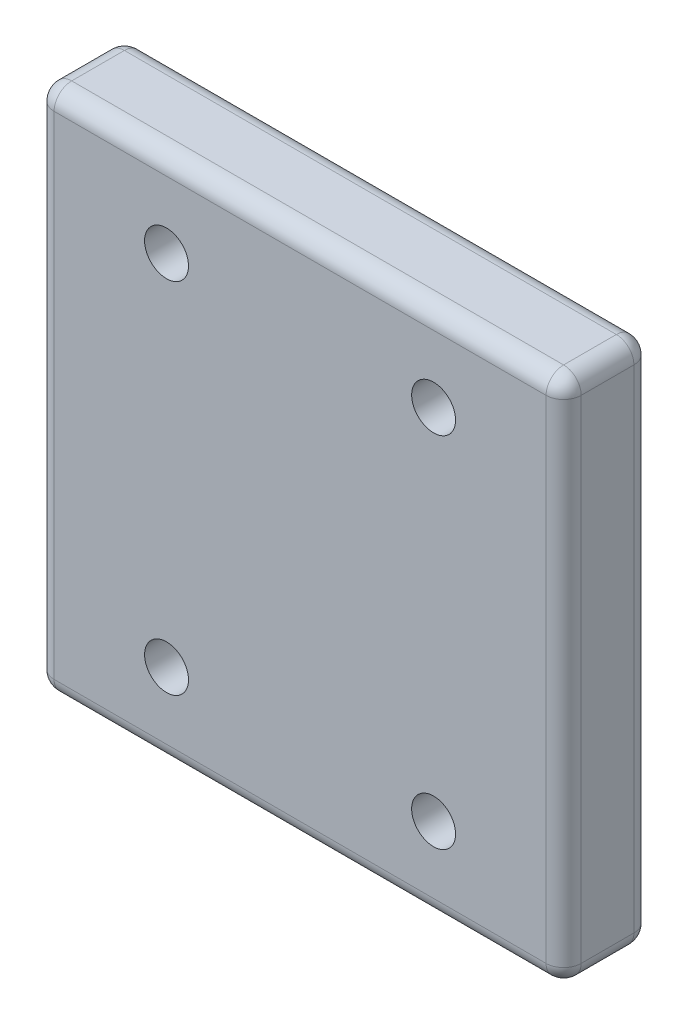
ISO-10303-21;
HEADER;
FILE_DESCRIPTION(('STEP AP214'),'2;1');
FILE_NAME('part.step','',(''),(''),'','','');
FILE_SCHEMA(('AUTOMOTIVE_DESIGN { 1 0 10303 214 1 1 1 1 }'));
ENDSEC;
DATA;
#1=APPLICATION_CONTEXT('core data for automotive mechanical design processes');
#2=APPLICATION_PROTOCOL_DEFINITION('international standard','automotive_design',2000,#1);
#3=PRODUCT_CONTEXT('',#1,'mechanical');
#4=PRODUCT('Part','Part','',(#3));
#5=PRODUCT_RELATED_PRODUCT_CATEGORY('part','',(#4));
#6=PRODUCT_DEFINITION_FORMATION('','',#4);
#7=PRODUCT_DEFINITION_CONTEXT('part definition',#1,'design');
#8=PRODUCT_DEFINITION('design','',#6,#7);
#9=PRODUCT_DEFINITION_SHAPE('','',#8);
#10=(LENGTH_UNIT() NAMED_UNIT(*) SI_UNIT(.MILLI.,.METRE.));
#11=(NAMED_UNIT(*) PLANE_ANGLE_UNIT() SI_UNIT($,.RADIAN.));
#12=(NAMED_UNIT(*) SI_UNIT($,.STERADIAN.) SOLID_ANGLE_UNIT());
#13=UNCERTAINTY_MEASURE_WITH_UNIT(LENGTH_MEASURE(1.E-05),#10,'distance_accuracy_value','');
#14=(GEOMETRIC_REPRESENTATION_CONTEXT(3) GLOBAL_UNCERTAINTY_ASSIGNED_CONTEXT((#13)) GLOBAL_UNIT_ASSIGNED_CONTEXT((#10,
#11,#12)) REPRESENTATION_CONTEXT('',''));
#15=CARTESIAN_POINT('',(0.,0.,0.));
#16=DIRECTION('',(0.,0.,1.));
#17=DIRECTION('',(1.,0.,0.));
#18=AXIS2_PLACEMENT_3D('',#15,#16,#17);
#19=CARTESIAN_POINT('',(0.,0.,3.175));
#20=DIRECTION('',(0.,0.,1.));
#21=DIRECTION('',(1.,0.,0.));
#22=AXIS2_PLACEMENT_3D('',#19,#20,#21);
#23=PLANE('',#22);
#24=DIRECTION('',(0.,-1.,0.));
#25=VECTOR('',#24,1.);
#26=CARTESIAN_POINT('',(-8.89000000000001,-9.525,3.175));
#27=LINE('',#26,#25);
#28=CARTESIAN_POINT('',(-8.89000000000001,8.89,3.175));
#29=VERTEX_POINT('',#28);
#30=CARTESIAN_POINT('',(-8.89000000000001,-8.89,3.175));
#31=VERTEX_POINT('',#30);
#32=EDGE_CURVE('E164',#29,#31,#27,.T.);
#33=ORIENTED_EDGE('',*,*,#32,.T.);
#34=DIRECTION('',(1.,0.,0.));
#35=VECTOR('',#34,1.);
#36=CARTESIAN_POINT('',(9.52500000000001,-8.89,3.175));
#37=LINE('',#36,#35);
#38=CARTESIAN_POINT('',(8.89000000000001,-8.89,3.175));
#39=VERTEX_POINT('',#38);
#40=EDGE_CURVE('E136',#31,#39,#37,.T.);
#41=ORIENTED_EDGE('',*,*,#40,.T.);
#42=DIRECTION('',(0.,1.,0.));
#43=VECTOR('',#42,1.);
#44=CARTESIAN_POINT('',(8.89000000000001,9.525,3.175));
#45=LINE('',#44,#43);
#46=CARTESIAN_POINT('',(8.89000000000001,8.89,3.175));
#47=VERTEX_POINT('',#46);
#48=EDGE_CURVE('E153',#39,#47,#45,.T.);
#49=ORIENTED_EDGE('',*,*,#48,.T.);
#50=DIRECTION('',(-1.,0.,0.));
#51=VECTOR('',#50,1.);
#52=CARTESIAN_POINT('',(-9.52500000000001,8.89,3.175));
#53=LINE('',#52,#51);
#54=EDGE_CURVE('E159',#47,#29,#53,.T.);
#55=ORIENTED_EDGE('',*,*,#54,.T.);
#56=EDGE_LOOP('',(#33,#41,#49,#55));
#57=FACE_BOUND('',#56,.T.);
#58=CARTESIAN_POINT('',(4.826,6.477,3.175));
#59=DIRECTION('',(0.,0.,1.));
#60=DIRECTION('',(-1.,0.,0.));
#61=AXIS2_PLACEMENT_3D('',#58,#59,#60);
#62=CIRCLE('',#61,0.79375);
#63=CARTESIAN_POINT('',(4.03225,6.477,3.175));
#64=VERTEX_POINT('',#63);
#65=EDGE_CURVE('E277',#64,#64,#62,.T.);
#66=ORIENTED_EDGE('',*,*,#65,.F.);
#67=EDGE_LOOP('',(#66));
#68=FACE_BOUND('',#67,.T.);
#69=CARTESIAN_POINT('',(-4.826,-6.477,3.175));
#70=DIRECTION('',(0.,0.,1.));
#71=DIRECTION('',(1.,0.,0.));
#72=AXIS2_PLACEMENT_3D('',#69,#70,#71);
#73=CIRCLE('',#72,0.79375);
#74=CARTESIAN_POINT('',(-4.03225,-6.477,3.175));
#75=VERTEX_POINT('',#74);
#76=EDGE_CURVE('E160',#75,#75,#73,.T.);
#77=ORIENTED_EDGE('',*,*,#76,.F.);
#78=EDGE_LOOP('',(#77));
#79=FACE_BOUND('',#78,.T.);
#80=CARTESIAN_POINT('',(4.826,-6.477,3.175));
#81=DIRECTION('',(0.,0.,1.));
#82=DIRECTION('',(1.,0.,0.));
#83=AXIS2_PLACEMENT_3D('',#80,#81,#82);
#84=CIRCLE('',#83,0.79375);
#85=CARTESIAN_POINT('',(5.61975,-6.477,3.175));
#86=VERTEX_POINT('',#85);
#87=EDGE_CURVE('E283',#86,#86,#84,.T.);
#88=ORIENTED_EDGE('',*,*,#87,.F.);
#89=EDGE_LOOP('',(#88));
#90=FACE_BOUND('',#89,.T.);
#91=CARTESIAN_POINT('',(-4.82599999999999,6.47700000000001,3.175));
#92=DIRECTION('',(0.,0.,1.));
#93=DIRECTION('',(-1.,0.,0.));
#94=AXIS2_PLACEMENT_3D('',#91,#92,#93);
#95=CIRCLE('',#94,0.79375);
#96=CARTESIAN_POINT('',(-5.61974999999999,6.47700000000001,3.175));
#97=VERTEX_POINT('',#96);
#98=EDGE_CURVE('E269',#97,#97,#95,.T.);
#99=ORIENTED_EDGE('',*,*,#98,.F.);
#100=EDGE_LOOP('',(#99));
#101=FACE_BOUND('',#100,.T.);
#102=ADVANCED_FACE('F42',(#57,#68,#79,#90,#101),#23,.T.);
#103=CARTESIAN_POINT('',(0.,0.,0.));
#104=DIRECTION('',(0.,0.,1.));
#105=DIRECTION('',(1.,0.,0.));
#106=AXIS2_PLACEMENT_3D('',#103,#104,#105);
#107=PLANE('',#106);
#108=DIRECTION('',(0.,1.,0.));
#109=VECTOR('',#108,1.);
#110=CARTESIAN_POINT('',(8.89000000000001,0.,0.));
#111=LINE('',#110,#109);
#112=CARTESIAN_POINT('',(8.89000000000001,8.89,0.));
#113=VERTEX_POINT('',#112);
#114=CARTESIAN_POINT('',(8.89000000000001,-8.89,0.));
#115=VERTEX_POINT('',#114);
#116=EDGE_CURVE('E177',#113,#115,#111,.F.);
#117=ORIENTED_EDGE('',*,*,#116,.T.);
#118=DIRECTION('',(1.,0.,0.));
#119=VECTOR('',#118,1.);
#120=CARTESIAN_POINT('',(0.,-8.89,0.));
#121=LINE('',#120,#119);
#122=CARTESIAN_POINT('',(-8.89000000000001,-8.89,0.));
#123=VERTEX_POINT('',#122);
#124=EDGE_CURVE('E183',#115,#123,#121,.F.);
#125=ORIENTED_EDGE('',*,*,#124,.T.);
#126=DIRECTION('',(0.,-1.,0.));
#127=VECTOR('',#126,1.);
#128=CARTESIAN_POINT('',(-8.89000000000001,0.,0.));
#129=LINE('',#128,#127);
#130=CARTESIAN_POINT('',(-8.89000000000001,8.89,0.));
#131=VERTEX_POINT('',#130);
#132=EDGE_CURVE('E181',#123,#131,#129,.F.);
#133=ORIENTED_EDGE('',*,*,#132,.T.);
#134=DIRECTION('',(-1.,0.,0.));
#135=VECTOR('',#134,1.);
#136=CARTESIAN_POINT('',(0.,8.89,0.));
#137=LINE('',#136,#135);
#138=EDGE_CURVE('E179',#131,#113,#137,.F.);
#139=ORIENTED_EDGE('',*,*,#138,.T.);
#140=EDGE_LOOP('',(#117,#125,#133,#139));
#141=FACE_BOUND('',#140,.T.);
#142=CARTESIAN_POINT('',(-4.826,-6.477,0.));
#143=DIRECTION('',(0.,0.,1.));
#144=DIRECTION('',(1.,0.,0.));
#145=AXIS2_PLACEMENT_3D('',#142,#143,#144);
#146=CIRCLE('',#145,0.79375);
#147=CARTESIAN_POINT('',(-4.03225,-6.477,0.));
#148=VERTEX_POINT('',#147);
#149=EDGE_CURVE('E286',#148,#148,#146,.T.);
#150=ORIENTED_EDGE('',*,*,#149,.T.);
#151=EDGE_LOOP('',(#150));
#152=FACE_BOUND('',#151,.T.);
#153=CARTESIAN_POINT('',(4.826,-6.477,0.));
#154=DIRECTION('',(0.,0.,1.));
#155=DIRECTION('',(1.,0.,0.));
#156=AXIS2_PLACEMENT_3D('',#153,#154,#155);
#157=CIRCLE('',#156,0.79375);
#158=CARTESIAN_POINT('',(5.61975,-6.477,0.));
#159=VERTEX_POINT('',#158);
#160=EDGE_CURVE('E280',#159,#159,#157,.T.);
#161=ORIENTED_EDGE('',*,*,#160,.T.);
#162=EDGE_LOOP('',(#161));
#163=FACE_BOUND('',#162,.T.);
#164=CARTESIAN_POINT('',(4.826,6.477,0.));
#165=DIRECTION('',(0.,0.,1.));
#166=DIRECTION('',(-1.,0.,0.));
#167=AXIS2_PLACEMENT_3D('',#164,#165,#166);
#168=CIRCLE('',#167,0.79375);
#169=CARTESIAN_POINT('',(4.03225,6.477,0.));
#170=VERTEX_POINT('',#169);
#171=EDGE_CURVE('E274',#170,#170,#168,.T.);
#172=ORIENTED_EDGE('',*,*,#171,.T.);
#173=EDGE_LOOP('',(#172));
#174=FACE_BOUND('',#173,.T.);
#175=CARTESIAN_POINT('',(-4.82599999999999,6.47700000000001,0.));
#176=DIRECTION('',(0.,0.,1.));
#177=DIRECTION('',(-1.,0.,0.));
#178=AXIS2_PLACEMENT_3D('',#175,#176,#177);
#179=CIRCLE('',#178,0.79375);
#180=CARTESIAN_POINT('',(-5.61974999999999,6.47700000000001,0.));
#181=VERTEX_POINT('',#180);
#182=EDGE_CURVE('E263',#181,#181,#179,.T.);
#183=ORIENTED_EDGE('',*,*,#182,.T.);
#184=EDGE_LOOP('',(#183));
#185=FACE_BOUND('',#184,.T.);
#186=ADVANCED_FACE('F346',(#141,#152,#163,#174,#185),#107,.F.);
#187=CARTESIAN_POINT('',(9.52500000000001,9.525,3.175));
#188=DIRECTION('',(0.,-1.,0.));
#189=DIRECTION('',(0.,0.,-1.));
#190=AXIS2_PLACEMENT_3D('',#187,#188,#189);
#191=PLANE('',#190);
#192=DIRECTION('',(0.,0.,-1.));
#193=VECTOR('',#192,1.);
#194=CARTESIAN_POINT('',(-8.89000000000001,9.525,3.175));
#195=LINE('',#194,#193);
#196=CARTESIAN_POINT('',(-8.89000000000001,9.525,0.635));
#197=VERTEX_POINT('',#196);
#198=CARTESIAN_POINT('',(-8.89000000000001,9.525,2.54));
#199=VERTEX_POINT('',#198);
#200=EDGE_CURVE('E199',#197,#199,#195,.F.);
#201=ORIENTED_EDGE('',*,*,#200,.T.);
#202=DIRECTION('',(-1.,0.,0.));
#203=VECTOR('',#202,1.);
#204=CARTESIAN_POINT('',(9.52500000000001,9.525,2.54));
#205=LINE('',#204,#203);
#206=CARTESIAN_POINT('',(8.89000000000001,9.525,2.54));
#207=VERTEX_POINT('',#206);
#208=EDGE_CURVE('E201',#199,#207,#205,.F.);
#209=ORIENTED_EDGE('',*,*,#208,.T.);
#210=DIRECTION('',(0.,0.,-1.));
#211=VECTOR('',#210,1.);
#212=CARTESIAN_POINT('',(8.89000000000001,9.525,3.175));
#213=LINE('',#212,#211);
#214=CARTESIAN_POINT('',(8.89000000000001,9.525,0.635));
#215=VERTEX_POINT('',#214);
#216=EDGE_CURVE('E195',#207,#215,#213,.T.);
#217=ORIENTED_EDGE('',*,*,#216,.T.);
#218=DIRECTION('',(-1.,0.,0.));
#219=VECTOR('',#218,1.);
#220=CARTESIAN_POINT('',(9.52500000000001,9.525,0.635));
#221=LINE('',#220,#219);
#222=EDGE_CURVE('E197',#215,#197,#221,.T.);
#223=ORIENTED_EDGE('',*,*,#222,.T.);
#224=EDGE_LOOP('',(#201,#209,#217,#223));
#225=FACE_BOUND('',#224,.T.);
#226=ADVANCED_FACE('F352',(#225),#191,.F.);
#227=CARTESIAN_POINT('',(-9.52500000000001,9.525,3.175));
#228=DIRECTION('',(1.,0.,0.));
#229=DIRECTION('',(0.,0.,-1.));
#230=AXIS2_PLACEMENT_3D('',#227,#228,#229);
#231=PLANE('',#230);
#232=DIRECTION('',(0.,0.,-1.));
#233=VECTOR('',#232,1.);
#234=CARTESIAN_POINT('',(-9.52500000000001,-8.89,3.175));
#235=LINE('',#234,#233);
#236=CARTESIAN_POINT('',(-9.52500000000001,-8.89,0.635));
#237=VERTEX_POINT('',#236);
#238=CARTESIAN_POINT('',(-9.52500000000001,-8.89,2.54));
#239=VERTEX_POINT('',#238);
#240=EDGE_CURVE('E190',#237,#239,#235,.F.);
#241=ORIENTED_EDGE('',*,*,#240,.T.);
#242=DIRECTION('',(0.,-1.,0.));
#243=VECTOR('',#242,1.);
#244=CARTESIAN_POINT('',(-9.52500000000001,9.525,2.54));
#245=LINE('',#244,#243);
#246=CARTESIAN_POINT('',(-9.52500000000001,8.89,2.54));
#247=VERTEX_POINT('',#246);
#248=EDGE_CURVE('E192',#239,#247,#245,.F.);
#249=ORIENTED_EDGE('',*,*,#248,.T.);
#250=DIRECTION('',(0.,0.,-1.));
#251=VECTOR('',#250,1.);
#252=CARTESIAN_POINT('',(-9.52500000000001,8.89,3.175));
#253=LINE('',#252,#251);
#254=CARTESIAN_POINT('',(-9.52500000000001,8.89,0.635));
#255=VERTEX_POINT('',#254);
#256=EDGE_CURVE('E186',#247,#255,#253,.T.);
#257=ORIENTED_EDGE('',*,*,#256,.T.);
#258=DIRECTION('',(0.,-1.,0.));
#259=VECTOR('',#258,1.);
#260=CARTESIAN_POINT('',(-9.52500000000001,9.525,0.635));
#261=LINE('',#260,#259);
#262=EDGE_CURVE('E188',#255,#237,#261,.T.);
#263=ORIENTED_EDGE('',*,*,#262,.T.);
#264=EDGE_LOOP('',(#241,#249,#257,#263));
#265=FACE_BOUND('',#264,.T.);
#266=ADVANCED_FACE('F363',(#265),#231,.F.);
#267=CARTESIAN_POINT('',(-9.52500000000001,-9.525,3.175));
#268=DIRECTION('',(0.,1.,0.));
#269=DIRECTION('',(0.,0.,1.));
#270=AXIS2_PLACEMENT_3D('',#267,#268,#269);
#271=PLANE('',#270);
#272=DIRECTION('',(1.,0.,0.));
#273=VECTOR('',#272,1.);
#274=CARTESIAN_POINT('',(-9.52500000000001,-9.525,2.54));
#275=LINE('',#274,#273);
#276=CARTESIAN_POINT('',(8.89000000000001,-9.525,2.54));
#277=VERTEX_POINT('',#276);
#278=CARTESIAN_POINT('',(-8.89000000000001,-9.525,2.54));
#279=VERTEX_POINT('',#278);
#280=EDGE_CURVE('E138',#277,#279,#275,.F.);
#281=ORIENTED_EDGE('',*,*,#280,.T.);
#282=DIRECTION('',(0.,0.,-1.));
#283=VECTOR('',#282,1.);
#284=CARTESIAN_POINT('',(-8.89000000000001,-9.525,3.175));
#285=LINE('',#284,#283);
#286=CARTESIAN_POINT('',(-8.89000000000001,-9.525,0.635));
#287=VERTEX_POINT('',#286);
#288=EDGE_CURVE('E175',#279,#287,#285,.T.);
#289=ORIENTED_EDGE('',*,*,#288,.T.);
#290=DIRECTION('',(1.,0.,0.));
#291=VECTOR('',#290,1.);
#292=CARTESIAN_POINT('',(-9.52500000000001,-9.525,0.635));
#293=LINE('',#292,#291);
#294=CARTESIAN_POINT('',(8.89000000000001,-9.525,0.635));
#295=VERTEX_POINT('',#294);
#296=EDGE_CURVE('E168',#287,#295,#293,.T.);
#297=ORIENTED_EDGE('',*,*,#296,.T.);
#298=DIRECTION('',(0.,0.,-1.));
#299=VECTOR('',#298,1.);
#300=CARTESIAN_POINT('',(8.89000000000001,-9.525,3.175));
#301=LINE('',#300,#299);
#302=EDGE_CURVE('E166',#295,#277,#301,.F.);
#303=ORIENTED_EDGE('',*,*,#302,.T.);
#304=EDGE_LOOP('',(#281,#289,#297,#303));
#305=FACE_BOUND('',#304,.T.);
#306=ADVANCED_FACE('F316',(#305),#271,.F.);
#307=CARTESIAN_POINT('',(9.52500000000001,-9.525,3.175));
#308=DIRECTION('',(-1.,0.,0.));
#309=DIRECTION('',(0.,0.,1.));
#310=AXIS2_PLACEMENT_3D('',#307,#308,#309);
#311=PLANE('',#310);
#312=DIRECTION('',(0.,1.,0.));
#313=VECTOR('',#312,1.);
#314=CARTESIAN_POINT('',(9.52500000000001,-9.525,2.54));
#315=LINE('',#314,#313);
#316=CARTESIAN_POINT('',(9.52500000000001,8.89,2.54));
#317=VERTEX_POINT('',#316);
#318=CARTESIAN_POINT('',(9.52500000000001,-8.89,2.54));
#319=VERTEX_POINT('',#318);
#320=EDGE_CURVE('E51',#317,#319,#315,.F.);
#321=ORIENTED_EDGE('',*,*,#320,.T.);
#322=DIRECTION('',(0.,0.,-1.));
#323=VECTOR('',#322,1.);
#324=CARTESIAN_POINT('',(9.52500000000001,-8.89,3.175));
#325=LINE('',#324,#323);
#326=CARTESIAN_POINT('',(9.52500000000001,-8.89,0.635));
#327=VERTEX_POINT('',#326);
#328=EDGE_CURVE('E11',#319,#327,#325,.T.);
#329=ORIENTED_EDGE('',*,*,#328,.T.);
#330=DIRECTION('',(0.,1.,0.));
#331=VECTOR('',#330,1.);
#332=CARTESIAN_POINT('',(9.52500000000001,-9.525,0.635));
#333=LINE('',#332,#331);
#334=CARTESIAN_POINT('',(9.52500000000001,8.89,0.635));
#335=VERTEX_POINT('',#334);
#336=EDGE_CURVE('E204',#327,#335,#333,.T.);
#337=ORIENTED_EDGE('',*,*,#336,.T.);
#338=DIRECTION('',(0.,0.,-1.));
#339=VECTOR('',#338,1.);
#340=CARTESIAN_POINT('',(9.52500000000001,8.89,3.175));
#341=LINE('',#340,#339);
#342=EDGE_CURVE('E62',#335,#317,#341,.F.);
#343=ORIENTED_EDGE('',*,*,#342,.T.);
#344=EDGE_LOOP('',(#321,#329,#337,#343));
#345=FACE_BOUND('',#344,.T.);
#346=ADVANCED_FACE('F322',(#345),#311,.F.);
#347=CARTESIAN_POINT('',(-4.826,-6.477,3.175));
#348=DIRECTION('',(0.,0.,-1.));
#349=DIRECTION('',(-1.,0.,0.));
#350=AXIS2_PLACEMENT_3D('',#347,#348,#349);
#351=CYLINDRICAL_SURFACE('',#350,0.79375);
#352=ORIENTED_EDGE('',*,*,#76,.T.);
#353=EDGE_LOOP('',(#352));
#354=FACE_BOUND('',#353,.T.);
#355=ORIENTED_EDGE('',*,*,#149,.F.);
#356=EDGE_LOOP('',(#355));
#357=FACE_BOUND('',#356,.T.);
#358=ADVANCED_FACE('F356',(#354,#357),#351,.F.);
#359=CARTESIAN_POINT('',(4.826,-6.477,3.175));
#360=DIRECTION('',(0.,0.,-1.));
#361=DIRECTION('',(-1.,0.,0.));
#362=AXIS2_PLACEMENT_3D('',#359,#360,#361);
#363=CYLINDRICAL_SURFACE('',#362,0.79375);
#364=ORIENTED_EDGE('',*,*,#87,.T.);
#365=EDGE_LOOP('',(#364));
#366=FACE_BOUND('',#365,.T.);
#367=ORIENTED_EDGE('',*,*,#160,.F.);
#368=EDGE_LOOP('',(#367));
#369=FACE_BOUND('',#368,.T.);
#370=ADVANCED_FACE('F531',(#366,#369),#363,.F.);
#371=CARTESIAN_POINT('',(4.826,6.477,3.175));
#372=DIRECTION('',(0.,0.,-1.));
#373=DIRECTION('',(-1.,0.,0.));
#374=AXIS2_PLACEMENT_3D('',#371,#372,#373);
#375=CYLINDRICAL_SURFACE('',#374,0.79375);
#376=ORIENTED_EDGE('',*,*,#65,.T.);
#377=EDGE_LOOP('',(#376));
#378=FACE_BOUND('',#377,.T.);
#379=ORIENTED_EDGE('',*,*,#171,.F.);
#380=EDGE_LOOP('',(#379));
#381=FACE_BOUND('',#380,.T.);
#382=ADVANCED_FACE('F522',(#378,#381),#375,.F.);
#383=CARTESIAN_POINT('',(-4.82599999999999,6.47700000000001,3.175));
#384=DIRECTION('',(0.,0.,-1.));
#385=DIRECTION('',(-1.,0.,0.));
#386=AXIS2_PLACEMENT_3D('',#383,#384,#385);
#387=CYLINDRICAL_SURFACE('',#386,0.79375);
#388=ORIENTED_EDGE('',*,*,#98,.T.);
#389=EDGE_LOOP('',(#388));
#390=FACE_BOUND('',#389,.T.);
#391=ORIENTED_EDGE('',*,*,#182,.F.);
#392=EDGE_LOOP('',(#391));
#393=FACE_BOUND('',#392,.T.);
#394=ADVANCED_FACE('F515',(#390,#393),#387,.F.);
#395=CARTESIAN_POINT('',(9.52500000000001,8.89,0.635));
#396=DIRECTION('',(-1.,0.,0.));
#397=DIRECTION('',(0.,0.,1.));
#398=AXIS2_PLACEMENT_3D('',#395,#396,#397);
#399=CYLINDRICAL_SURFACE('',#398,0.635);
#400=CARTESIAN_POINT('',(-8.89000000000001,8.89,0.635));
#401=DIRECTION('',(-1.,0.,0.));
#402=DIRECTION('',(0.,0.,1.));
#403=AXIS2_PLACEMENT_3D('',#400,#401,#402);
#404=CIRCLE('',#403,0.635);
#405=EDGE_CURVE('E46',#197,#131,#404,.T.);
#406=ORIENTED_EDGE('',*,*,#405,.F.);
#407=ORIENTED_EDGE('',*,*,#222,.F.);
#408=CARTESIAN_POINT('',(8.89000000000001,8.89,0.635));
#409=DIRECTION('',(1.,0.,0.));
#410=DIRECTION('',(0.,0.,-1.));
#411=AXIS2_PLACEMENT_3D('',#408,#409,#410);
#412=CIRCLE('',#411,0.635);
#413=EDGE_CURVE('E256',#113,#215,#412,.T.);
#414=ORIENTED_EDGE('',*,*,#413,.F.);
#415=ORIENTED_EDGE('',*,*,#138,.F.);
#416=EDGE_LOOP('',(#406,#407,#414,#415));
#417=FACE_BOUND('',#416,.T.);
#418=ADVANCED_FACE('F44',(#417),#399,.T.);
#419=CARTESIAN_POINT('',(-8.89000000000001,8.89,0.635));
#420=DIRECTION('',(0.,0.,-1.));
#421=DIRECTION('',(-1.,0.,0.));
#422=AXIS2_PLACEMENT_3D('',#419,#420,#421);
#423=SPHERICAL_SURFACE('',#422,0.635);
#424=CARTESIAN_POINT('',(-8.89000000000001,8.89,0.635));
#425=DIRECTION('',(0.,0.,-1.));
#426=DIRECTION('',(-1.,0.,0.));
#427=AXIS2_PLACEMENT_3D('',#424,#425,#426);
#428=CIRCLE('',#427,0.635);
#429=EDGE_CURVE('E251',#197,#255,#428,.F.);
#430=ORIENTED_EDGE('',*,*,#429,.F.);
#431=ORIENTED_EDGE('',*,*,#405,.T.);
#432=CARTESIAN_POINT('',(-8.89000000000001,8.89,0.635));
#433=DIRECTION('',(0.,1.,0.));
#434=DIRECTION('',(0.,0.,1.));
#435=AXIS2_PLACEMENT_3D('',#432,#433,#434);
#436=CIRCLE('',#435,0.635);
#437=EDGE_CURVE('E254',#255,#131,#436,.F.);
#438=ORIENTED_EDGE('',*,*,#437,.F.);
#439=EDGE_LOOP('',(#430,#431,#438));
#440=FACE_BOUND('',#439,.T.);
#441=ADVANCED_FACE('F501',(#440),#423,.T.);
#442=CARTESIAN_POINT('',(8.89000000000001,8.89,0.635));
#443=DIRECTION('',(0.,1.,0.));
#444=DIRECTION('',(0.,0.,1.));
#445=AXIS2_PLACEMENT_3D('',#442,#443,#444);
#446=SPHERICAL_SURFACE('',#445,0.635);
#447=CARTESIAN_POINT('',(8.89000000000001,8.89,0.635));
#448=DIRECTION('',(0.,1.,0.));
#449=DIRECTION('',(0.,0.,1.));
#450=AXIS2_PLACEMENT_3D('',#447,#448,#449);
#451=CIRCLE('',#450,0.635);
#452=EDGE_CURVE('E245',#113,#335,#451,.F.);
#453=ORIENTED_EDGE('',*,*,#452,.F.);
#454=ORIENTED_EDGE('',*,*,#413,.T.);
#455=CARTESIAN_POINT('',(8.89000000000001,8.89,0.635));
#456=DIRECTION('',(0.,0.,-1.));
#457=DIRECTION('',(-1.,0.,0.));
#458=AXIS2_PLACEMENT_3D('',#455,#456,#457);
#459=CIRCLE('',#458,0.635);
#460=EDGE_CURVE('E248',#335,#215,#459,.F.);
#461=ORIENTED_EDGE('',*,*,#460,.F.);
#462=EDGE_LOOP('',(#453,#454,#461));
#463=FACE_BOUND('',#462,.T.);
#464=ADVANCED_FACE('F328',(#463),#446,.T.);
#465=CARTESIAN_POINT('',(-8.89000000000001,9.525,0.635));
#466=DIRECTION('',(0.,-1.,0.));
#467=DIRECTION('',(0.,0.,-1.));
#468=AXIS2_PLACEMENT_3D('',#465,#466,#467);
#469=CYLINDRICAL_SURFACE('',#468,0.635);
#470=ORIENTED_EDGE('',*,*,#437,.T.);
#471=ORIENTED_EDGE('',*,*,#132,.F.);
#472=CARTESIAN_POINT('',(-8.89000000000001,-8.89,0.635));
#473=DIRECTION('',(0.,-1.,0.));
#474=DIRECTION('',(0.,0.,-1.));
#475=AXIS2_PLACEMENT_3D('',#472,#473,#474);
#476=CIRCLE('',#475,0.635);
#477=EDGE_CURVE('E240',#237,#123,#476,.T.);
#478=ORIENTED_EDGE('',*,*,#477,.F.);
#479=ORIENTED_EDGE('',*,*,#262,.F.);
#480=EDGE_LOOP('',(#470,#471,#478,#479));
#481=FACE_BOUND('',#480,.T.);
#482=ADVANCED_FACE('F484',(#481),#469,.T.);
#483=CARTESIAN_POINT('',(-8.89000000000001,8.89,3.175));
#484=DIRECTION('',(0.,0.,-1.));
#485=DIRECTION('',(-1.,0.,0.));
#486=AXIS2_PLACEMENT_3D('',#483,#484,#485);
#487=CYLINDRICAL_SURFACE('',#486,0.635);
#488=ORIENTED_EDGE('',*,*,#429,.T.);
#489=ORIENTED_EDGE('',*,*,#256,.F.);
#490=CARTESIAN_POINT('',(-8.89000000000001,8.89,2.54));
#491=DIRECTION('',(0.,0.,1.));
#492=DIRECTION('',(1.,0.,0.));
#493=AXIS2_PLACEMENT_3D('',#490,#491,#492);
#494=CIRCLE('',#493,0.635);
#495=EDGE_CURVE('E237',#199,#247,#494,.T.);
#496=ORIENTED_EDGE('',*,*,#495,.F.);
#497=ORIENTED_EDGE('',*,*,#200,.F.);
#498=EDGE_LOOP('',(#488,#489,#496,#497));
#499=FACE_BOUND('',#498,.T.);
#500=ADVANCED_FACE('F476',(#499),#487,.T.);
#501=CARTESIAN_POINT('',(0.,8.89,2.54));
#502=DIRECTION('',(1.,0.,0.));
#503=DIRECTION('',(0.,0.,-1.));
#504=AXIS2_PLACEMENT_3D('',#501,#502,#503);
#505=CYLINDRICAL_SURFACE('',#504,0.635);
#506=CARTESIAN_POINT('',(8.89000000000001,8.89,2.54));
#507=DIRECTION('',(1.,0.,0.));
#508=DIRECTION('',(0.,0.,-1.));
#509=AXIS2_PLACEMENT_3D('',#506,#507,#508);
#510=CIRCLE('',#509,0.635);
#511=EDGE_CURVE('E231',#207,#47,#510,.T.);
#512=ORIENTED_EDGE('',*,*,#511,.F.);
#513=ORIENTED_EDGE('',*,*,#208,.F.);
#514=CARTESIAN_POINT('',(-8.89000000000001,8.89,2.54));
#515=DIRECTION('',(-1.,0.,0.));
#516=DIRECTION('',(0.,0.,1.));
#517=AXIS2_PLACEMENT_3D('',#514,#515,#516);
#518=CIRCLE('',#517,0.635);
#519=EDGE_CURVE('E234',#29,#199,#518,.T.);
#520=ORIENTED_EDGE('',*,*,#519,.F.);
#521=ORIENTED_EDGE('',*,*,#54,.F.);
#522=EDGE_LOOP('',(#512,#513,#520,#521));
#523=FACE_BOUND('',#522,.T.);
#524=ADVANCED_FACE('F297',(#523),#505,.T.);
#525=CARTESIAN_POINT('',(8.89000000000001,8.89,3.175));
#526=DIRECTION('',(0.,0.,-1.));
#527=DIRECTION('',(-1.,0.,0.));
#528=AXIS2_PLACEMENT_3D('',#525,#526,#527);
#529=CYLINDRICAL_SURFACE('',#528,0.635);
#530=ORIENTED_EDGE('',*,*,#460,.T.);
#531=ORIENTED_EDGE('',*,*,#216,.F.);
#532=CARTESIAN_POINT('',(8.89000000000001,8.89,2.54));
#533=DIRECTION('',(0.,0.,1.));
#534=DIRECTION('',(1.,0.,0.));
#535=AXIS2_PLACEMENT_3D('',#532,#533,#534);
#536=CIRCLE('',#535,0.635);
#537=EDGE_CURVE('E229',#317,#207,#536,.T.);
#538=ORIENTED_EDGE('',*,*,#537,.F.);
#539=ORIENTED_EDGE('',*,*,#342,.F.);
#540=EDGE_LOOP('',(#530,#531,#538,#539));
#541=FACE_BOUND('',#540,.T.);
#542=ADVANCED_FACE('F331',(#541),#529,.T.);
#543=CARTESIAN_POINT('',(8.89000000000001,-9.525,0.635));
#544=DIRECTION('',(0.,1.,0.));
#545=DIRECTION('',(0.,0.,1.));
#546=AXIS2_PLACEMENT_3D('',#543,#544,#545);
#547=CYLINDRICAL_SURFACE('',#546,0.635);
#548=ORIENTED_EDGE('',*,*,#452,.T.);
#549=ORIENTED_EDGE('',*,*,#336,.F.);
#550=CARTESIAN_POINT('',(8.89000000000001,-8.89,0.635));
#551=DIRECTION('',(0.,-1.,0.));
#552=DIRECTION('',(0.,0.,-1.));
#553=AXIS2_PLACEMENT_3D('',#550,#551,#552);
#554=CIRCLE('',#553,0.635);
#555=EDGE_CURVE('E226',#115,#327,#554,.T.);
#556=ORIENTED_EDGE('',*,*,#555,.F.);
#557=ORIENTED_EDGE('',*,*,#116,.F.);
#558=EDGE_LOOP('',(#548,#549,#556,#557));
#559=FACE_BOUND('',#558,.T.);
#560=ADVANCED_FACE('F327',(#559),#547,.T.);
#561=CARTESIAN_POINT('',(-9.52500000000001,-8.89,0.635));
#562=DIRECTION('',(1.,0.,0.));
#563=DIRECTION('',(0.,0.,-1.));
#564=AXIS2_PLACEMENT_3D('',#561,#562,#563);
#565=CYLINDRICAL_SURFACE('',#564,0.635);
#566=CARTESIAN_POINT('',(-8.89000000000001,-8.89,0.635));
#567=DIRECTION('',(-1.,0.,0.));
#568=DIRECTION('',(0.,0.,1.));
#569=AXIS2_PLACEMENT_3D('',#566,#567,#568);
#570=CIRCLE('',#569,0.635);
#571=EDGE_CURVE('E242',#123,#287,#570,.T.);
#572=ORIENTED_EDGE('',*,*,#571,.F.);
#573=ORIENTED_EDGE('',*,*,#124,.F.);
#574=CARTESIAN_POINT('',(8.89000000000001,-8.89,0.635));
#575=DIRECTION('',(1.,0.,0.));
#576=DIRECTION('',(0.,0.,-1.));
#577=AXIS2_PLACEMENT_3D('',#574,#575,#576);
#578=CIRCLE('',#577,0.635);
#579=EDGE_CURVE('E223',#295,#115,#578,.T.);
#580=ORIENTED_EDGE('',*,*,#579,.F.);
#581=ORIENTED_EDGE('',*,*,#296,.F.);
#582=EDGE_LOOP('',(#572,#573,#580,#581));
#583=FACE_BOUND('',#582,.T.);
#584=ADVANCED_FACE('F445',(#583),#565,.T.);
#585=CARTESIAN_POINT('',(-8.89000000000001,-8.89,0.635));
#586=DIRECTION('',(0.,0.,-1.));
#587=DIRECTION('',(-1.,0.,0.));
#588=AXIS2_PLACEMENT_3D('',#585,#586,#587);
#589=SPHERICAL_SURFACE('',#588,0.635);
#590=ORIENTED_EDGE('',*,*,#477,.T.);
#591=ORIENTED_EDGE('',*,*,#571,.T.);
#592=CARTESIAN_POINT('',(-8.89000000000001,-8.89,0.635));
#593=DIRECTION('',(0.,0.,-1.));
#594=DIRECTION('',(-1.,0.,0.));
#595=AXIS2_PLACEMENT_3D('',#592,#593,#594);
#596=CIRCLE('',#595,0.635);
#597=EDGE_CURVE('E220',#237,#287,#596,.F.);
#598=ORIENTED_EDGE('',*,*,#597,.F.);
#599=EDGE_LOOP('',(#590,#591,#598));
#600=FACE_BOUND('',#599,.T.);
#601=ADVANCED_FACE('F343',(#600),#589,.T.);
#602=CARTESIAN_POINT('',(-8.89000000000001,8.89,2.54));
#603=DIRECTION('',(0.,1.,0.));
#604=DIRECTION('',(0.,0.,1.));
#605=AXIS2_PLACEMENT_3D('',#602,#603,#604);
#606=SPHERICAL_SURFACE('',#605,0.635);
#607=ORIENTED_EDGE('',*,*,#519,.T.);
#608=ORIENTED_EDGE('',*,*,#495,.T.);
#609=CARTESIAN_POINT('',(-8.89000000000001,8.89,2.54));
#610=DIRECTION('',(0.,1.,0.));
#611=DIRECTION('',(0.,0.,1.));
#612=AXIS2_PLACEMENT_3D('',#609,#610,#611);
#613=CIRCLE('',#612,0.635);
#614=EDGE_CURVE('E218',#29,#247,#613,.F.);
#615=ORIENTED_EDGE('',*,*,#614,.F.);
#616=EDGE_LOOP('',(#607,#608,#615));
#617=FACE_BOUND('',#616,.T.);
#618=ADVANCED_FACE('F300',(#617),#606,.T.);
#619=CARTESIAN_POINT('',(8.89000000000001,8.89,2.54));
#620=DIRECTION('',(0.,1.,0.));
#621=DIRECTION('',(0.,0.,1.));
#622=AXIS2_PLACEMENT_3D('',#619,#620,#621);
#623=SPHERICAL_SURFACE('',#622,0.635);
#624=ORIENTED_EDGE('',*,*,#537,.T.);
#625=ORIENTED_EDGE('',*,*,#511,.T.);
#626=CARTESIAN_POINT('',(8.89000000000001,8.89,2.54));
#627=DIRECTION('',(0.,1.,0.));
#628=DIRECTION('',(0.,0.,1.));
#629=AXIS2_PLACEMENT_3D('',#626,#627,#628);
#630=CIRCLE('',#629,0.635);
#631=EDGE_CURVE('E156',#317,#47,#630,.F.);
#632=ORIENTED_EDGE('',*,*,#631,.F.);
#633=EDGE_LOOP('',(#624,#625,#632));
#634=FACE_BOUND('',#633,.T.);
#635=ADVANCED_FACE('F333',(#634),#623,.T.);
#636=CARTESIAN_POINT('',(8.89000000000001,-8.89,0.635));
#637=DIRECTION('',(0.,0.,-1.));
#638=DIRECTION('',(-1.,0.,0.));
#639=AXIS2_PLACEMENT_3D('',#636,#637,#638);
#640=SPHERICAL_SURFACE('',#639,0.635);
#641=ORIENTED_EDGE('',*,*,#579,.T.);
#642=ORIENTED_EDGE('',*,*,#555,.T.);
#643=CARTESIAN_POINT('',(8.89000000000001,-8.89,0.635));
#644=DIRECTION('',(0.,0.,-1.));
#645=DIRECTION('',(-1.,0.,0.));
#646=AXIS2_PLACEMENT_3D('',#643,#644,#645);
#647=CIRCLE('',#646,0.635);
#648=EDGE_CURVE('E215',#295,#327,#647,.F.);
#649=ORIENTED_EDGE('',*,*,#648,.F.);
#650=EDGE_LOOP('',(#641,#642,#649));
#651=FACE_BOUND('',#650,.T.);
#652=ADVANCED_FACE('F335',(#651),#640,.T.);
#653=CARTESIAN_POINT('',(-8.89000000000001,-8.89,3.175));
#654=DIRECTION('',(0.,0.,-1.));
#655=DIRECTION('',(-1.,0.,0.));
#656=AXIS2_PLACEMENT_3D('',#653,#654,#655);
#657=CYLINDRICAL_SURFACE('',#656,0.635);
#658=ORIENTED_EDGE('',*,*,#597,.T.);
#659=ORIENTED_EDGE('',*,*,#288,.F.);
#660=CARTESIAN_POINT('',(-8.89000000000001,-8.89,2.54));
#661=DIRECTION('',(0.,0.,1.));
#662=DIRECTION('',(1.,0.,0.));
#663=AXIS2_PLACEMENT_3D('',#660,#661,#662);
#664=CIRCLE('',#663,0.635);
#665=EDGE_CURVE('E212',#239,#279,#664,.T.);
#666=ORIENTED_EDGE('',*,*,#665,.F.);
#667=ORIENTED_EDGE('',*,*,#240,.F.);
#668=EDGE_LOOP('',(#658,#659,#666,#667));
#669=FACE_BOUND('',#668,.T.);
#670=ADVANCED_FACE('F312',(#669),#657,.T.);
#671=CARTESIAN_POINT('',(-8.89000000000001,0.,2.54));
#672=DIRECTION('',(0.,1.,0.));
#673=DIRECTION('',(0.,0.,1.));
#674=AXIS2_PLACEMENT_3D('',#671,#672,#673);
#675=CYLINDRICAL_SURFACE('',#674,0.635);
#676=ORIENTED_EDGE('',*,*,#614,.T.);
#677=ORIENTED_EDGE('',*,*,#248,.F.);
#678=CARTESIAN_POINT('',(-8.89000000000001,-8.89,2.54));
#679=DIRECTION('',(0.,-1.,0.));
#680=DIRECTION('',(0.,0.,-1.));
#681=AXIS2_PLACEMENT_3D('',#678,#679,#680);
#682=CIRCLE('',#681,0.635);
#683=EDGE_CURVE('E150',#31,#239,#682,.T.);
#684=ORIENTED_EDGE('',*,*,#683,.F.);
#685=ORIENTED_EDGE('',*,*,#32,.F.);
#686=EDGE_LOOP('',(#676,#677,#684,#685));
#687=FACE_BOUND('',#686,.T.);
#688=ADVANCED_FACE('F304',(#687),#675,.T.);
#689=CARTESIAN_POINT('',(8.89000000000001,0.,2.54));
#690=DIRECTION('',(0.,-1.,0.));
#691=DIRECTION('',(0.,0.,-1.));
#692=AXIS2_PLACEMENT_3D('',#689,#690,#691);
#693=CYLINDRICAL_SURFACE('',#692,0.635);
#694=ORIENTED_EDGE('',*,*,#631,.T.);
#695=ORIENTED_EDGE('',*,*,#48,.F.);
#696=CARTESIAN_POINT('',(8.89000000000001,-8.89,2.54));
#697=DIRECTION('',(0.,-1.,0.));
#698=DIRECTION('',(0.,0.,-1.));
#699=AXIS2_PLACEMENT_3D('',#696,#697,#698);
#700=CIRCLE('',#699,0.635);
#701=EDGE_CURVE('E144',#319,#39,#700,.T.);
#702=ORIENTED_EDGE('',*,*,#701,.F.);
#703=ORIENTED_EDGE('',*,*,#320,.F.);
#704=EDGE_LOOP('',(#694,#695,#702,#703));
#705=FACE_BOUND('',#704,.T.);
#706=ADVANCED_FACE('F154',(#705),#693,.T.);
#707=CARTESIAN_POINT('',(8.89000000000001,-8.89,3.175));
#708=DIRECTION('',(0.,0.,-1.));
#709=DIRECTION('',(-1.,0.,0.));
#710=AXIS2_PLACEMENT_3D('',#707,#708,#709);
#711=CYLINDRICAL_SURFACE('',#710,0.635);
#712=ORIENTED_EDGE('',*,*,#648,.T.);
#713=ORIENTED_EDGE('',*,*,#328,.F.);
#714=CARTESIAN_POINT('',(8.89000000000001,-8.89,2.54));
#715=DIRECTION('',(0.,0.,1.));
#716=DIRECTION('',(1.,0.,0.));
#717=AXIS2_PLACEMENT_3D('',#714,#715,#716);
#718=CIRCLE('',#717,0.635);
#719=EDGE_CURVE('E148',#277,#319,#718,.T.);
#720=ORIENTED_EDGE('',*,*,#719,.F.);
#721=ORIENTED_EDGE('',*,*,#302,.F.);
#722=EDGE_LOOP('',(#712,#713,#720,#721));
#723=FACE_BOUND('',#722,.T.);
#724=ADVANCED_FACE('F320',(#723),#711,.T.);
#725=CARTESIAN_POINT('',(-8.89000000000001,-8.89,2.54));
#726=DIRECTION('',(-1.,0.,0.));
#727=DIRECTION('',(0.,0.,1.));
#728=AXIS2_PLACEMENT_3D('',#725,#726,#727);
#729=SPHERICAL_SURFACE('',#728,0.635);
#730=ORIENTED_EDGE('',*,*,#683,.T.);
#731=ORIENTED_EDGE('',*,*,#665,.T.);
#732=CARTESIAN_POINT('',(-8.89000000000001,-8.89,2.54));
#733=DIRECTION('',(-1.,0.,0.));
#734=DIRECTION('',(0.,0.,1.));
#735=AXIS2_PLACEMENT_3D('',#732,#733,#734);
#736=CIRCLE('',#735,0.635);
#737=EDGE_CURVE('E141',#31,#279,#736,.F.);
#738=ORIENTED_EDGE('',*,*,#737,.F.);
#739=EDGE_LOOP('',(#730,#731,#738));
#740=FACE_BOUND('',#739,.T.);
#741=ADVANCED_FACE('F308',(#740),#729,.T.);
#742=CARTESIAN_POINT('',(8.89000000000001,-8.89,2.54));
#743=DIRECTION('',(1.,0.,0.));
#744=DIRECTION('',(0.,0.,-1.));
#745=AXIS2_PLACEMENT_3D('',#742,#743,#744);
#746=SPHERICAL_SURFACE('',#745,0.635);
#747=ORIENTED_EDGE('',*,*,#719,.T.);
#748=ORIENTED_EDGE('',*,*,#701,.T.);
#749=CARTESIAN_POINT('',(8.89000000000001,-8.89,2.54));
#750=DIRECTION('',(1.,0.,0.));
#751=DIRECTION('',(0.,0.,-1.));
#752=AXIS2_PLACEMENT_3D('',#749,#750,#751);
#753=CIRCLE('',#752,0.635);
#754=EDGE_CURVE('E132',#277,#39,#753,.F.);
#755=ORIENTED_EDGE('',*,*,#754,.F.);
#756=EDGE_LOOP('',(#747,#748,#755));
#757=FACE_BOUND('',#756,.T.);
#758=ADVANCED_FACE('F146',(#757),#746,.T.);
#759=CARTESIAN_POINT('',(0.,-8.89,2.54));
#760=DIRECTION('',(-1.,0.,0.));
#761=DIRECTION('',(0.,0.,1.));
#762=AXIS2_PLACEMENT_3D('',#759,#760,#761);
#763=CYLINDRICAL_SURFACE('',#762,0.635);
#764=ORIENTED_EDGE('',*,*,#737,.T.);
#765=ORIENTED_EDGE('',*,*,#280,.F.);
#766=ORIENTED_EDGE('',*,*,#754,.T.);
#767=ORIENTED_EDGE('',*,*,#40,.F.);
#768=EDGE_LOOP('',(#764,#765,#766,#767));
#769=FACE_BOUND('',#768,.T.);
#770=ADVANCED_FACE('F134',(#769),#763,.T.);
#771=CLOSED_SHELL('',(#102,#186,#226,#266,#306,#346,#358,#370,#382,#394,#418,#441,#464,#482,
#500,#524,#542,#560,#584,#601,#618,#635,#652,#670,#688,#706,#724,#741,#758,#770));
#772=MANIFOLD_SOLID_BREP('B2',#771);
#773=ADVANCED_BREP_SHAPE_REPRESENTATION('',(#18,#772),#14);
#774=SHAPE_DEFINITION_REPRESENTATION(#9,#773);
ENDSEC;
END-ISO-10303-21;
